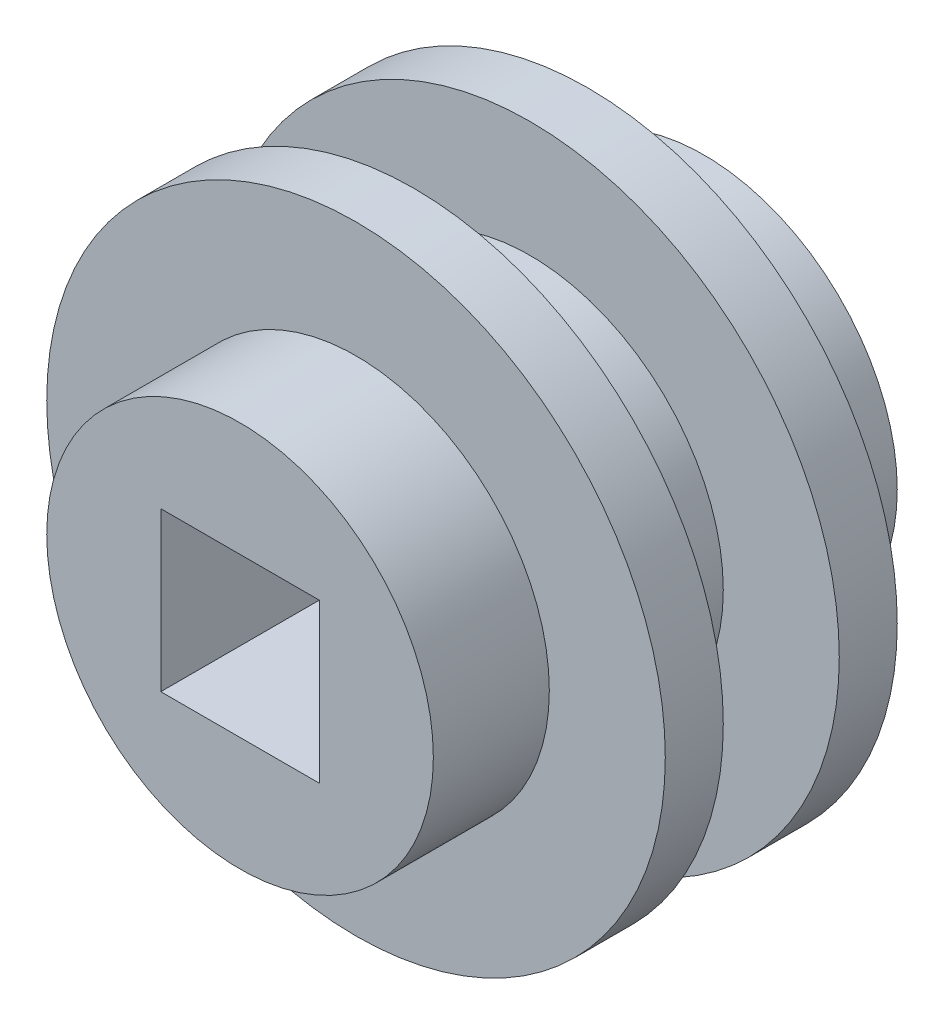
ISO-10303-21;
HEADER;
FILE_DESCRIPTION(('STEP AP214'),'2;1');
FILE_NAME('part.step','',(''),(''),'','','');
FILE_SCHEMA(('AUTOMOTIVE_DESIGN { 1 0 10303 214 1 1 1 1 }'));
ENDSEC;
DATA;
#1=APPLICATION_CONTEXT('core data for automotive mechanical design processes');
#2=APPLICATION_PROTOCOL_DEFINITION('international standard','automotive_design',2000,#1);
#3=PRODUCT_CONTEXT('',#1,'mechanical');
#4=PRODUCT('Part','Part','',(#3));
#5=PRODUCT_RELATED_PRODUCT_CATEGORY('part','',(#4));
#6=PRODUCT_DEFINITION_FORMATION('','',#4);
#7=PRODUCT_DEFINITION_CONTEXT('part definition',#1,'design');
#8=PRODUCT_DEFINITION('design','',#6,#7);
#9=PRODUCT_DEFINITION_SHAPE('','',#8);
#10=(LENGTH_UNIT() NAMED_UNIT(*) SI_UNIT(.MILLI.,.METRE.));
#11=(NAMED_UNIT(*) PLANE_ANGLE_UNIT() SI_UNIT($,.RADIAN.));
#12=(NAMED_UNIT(*) SI_UNIT($,.STERADIAN.) SOLID_ANGLE_UNIT());
#13=UNCERTAINTY_MEASURE_WITH_UNIT(LENGTH_MEASURE(1.E-05),#10,'distance_accuracy_value','');
#14=(GEOMETRIC_REPRESENTATION_CONTEXT(3) GLOBAL_UNCERTAINTY_ASSIGNED_CONTEXT((#13)) GLOBAL_UNIT_ASSIGNED_CONTEXT((#10,
#11,#12)) REPRESENTATION_CONTEXT('',''));
#15=CARTESIAN_POINT('',(0.,0.,0.));
#16=DIRECTION('',(0.,0.,1.));
#17=DIRECTION('',(1.,0.,0.));
#18=AXIS2_PLACEMENT_3D('',#15,#16,#17);
#19=CARTESIAN_POINT('',(0.,0.,3.));
#20=DIRECTION('',(0.,0.,-1.));
#21=DIRECTION('',(-1.,0.,0.));
#22=AXIS2_PLACEMENT_3D('',#19,#20,#21);
#23=CYLINDRICAL_SURFACE('',#22,8.);
#24=CARTESIAN_POINT('',(0.,0.,-3.));
#25=DIRECTION('',(0.,0.,1.));
#26=DIRECTION('',(1.,0.,0.));
#27=AXIS2_PLACEMENT_3D('',#24,#25,#26);
#28=CIRCLE('',#27,8.);
#29=CARTESIAN_POINT('',(8.,0.,-3.));
#30=VERTEX_POINT('',#29);
#31=EDGE_CURVE('E185',#30,#30,#28,.T.);
#32=ORIENTED_EDGE('',*,*,#31,.T.);
#33=EDGE_LOOP('',(#32));
#34=FACE_BOUND('',#33,.T.);
#35=CARTESIAN_POINT('',(0.,0.,-1.5));
#36=DIRECTION('',(0.,0.,1.));
#37=DIRECTION('',(1.,0.,0.));
#38=AXIS2_PLACEMENT_3D('',#35,#36,#37);
#39=CIRCLE('',#38,8.);
#40=CARTESIAN_POINT('',(8.,0.,-1.5));
#41=VERTEX_POINT('',#40);
#42=EDGE_CURVE('E189',#41,#41,#39,.T.);
#43=ORIENTED_EDGE('',*,*,#42,.F.);
#44=EDGE_LOOP('',(#43));
#45=FACE_BOUND('',#44,.T.);
#46=ADVANCED_FACE('F49',(#34,#45),#23,.T.);
#47=CARTESIAN_POINT('',(0.,0.,6.));
#48=DIRECTION('',(0.,0.,-1.));
#49=DIRECTION('',(-1.,0.,0.));
#50=AXIS2_PLACEMENT_3D('',#47,#48,#49);
#51=CYLINDRICAL_SURFACE('',#50,5.);
#52=CARTESIAN_POINT('',(0.,0.,-6.));
#53=DIRECTION('',(0.,0.,1.));
#54=DIRECTION('',(1.,0.,0.));
#55=AXIS2_PLACEMENT_3D('',#52,#53,#54);
#56=CIRCLE('',#55,5.);
#57=CARTESIAN_POINT('',(5.,0.,-6.));
#58=VERTEX_POINT('',#57);
#59=EDGE_CURVE('E113',#58,#58,#56,.T.);
#60=ORIENTED_EDGE('',*,*,#59,.T.);
#61=EDGE_LOOP('',(#60));
#62=FACE_BOUND('',#61,.T.);
#63=CARTESIAN_POINT('',(0.,0.,-3.));
#64=DIRECTION('',(0.,0.,1.));
#65=DIRECTION('',(1.,0.,0.));
#66=AXIS2_PLACEMENT_3D('',#63,#64,#65);
#67=CIRCLE('',#66,5.);
#68=CARTESIAN_POINT('',(5.,0.,-3.));
#69=VERTEX_POINT('',#68);
#70=EDGE_CURVE('E12',#69,#69,#67,.T.);
#71=ORIENTED_EDGE('',*,*,#70,.F.);
#72=EDGE_LOOP('',(#71));
#73=FACE_BOUND('',#72,.T.);
#74=ADVANCED_FACE('F148',(#62,#73),#51,.T.);
#75=CARTESIAN_POINT('',(2.05,0.,6.));
#76=DIRECTION('',(-1.,0.,0.));
#77=DIRECTION('',(0.,0.,1.));
#78=AXIS2_PLACEMENT_3D('',#75,#76,#77);
#79=PLANE('',#78);
#80=DIRECTION('',(0.,1.,0.));
#81=VECTOR('',#80,1.);
#82=CARTESIAN_POINT('',(2.05,0.,-6.));
#83=LINE('',#82,#81);
#84=CARTESIAN_POINT('',(2.05,-2.05,-6.));
#85=VERTEX_POINT('',#84);
#86=CARTESIAN_POINT('',(2.05,2.05,-6.));
#87=VERTEX_POINT('',#86);
#88=EDGE_CURVE('E121',#85,#87,#83,.T.);
#89=ORIENTED_EDGE('',*,*,#88,.F.);
#90=DIRECTION('',(0.,0.,-1.));
#91=VECTOR('',#90,1.);
#92=CARTESIAN_POINT('',(2.05,-2.05,6.));
#93=LINE('',#92,#91);
#94=CARTESIAN_POINT('',(2.05,-2.05,6.));
#95=VERTEX_POINT('',#94);
#96=EDGE_CURVE('E58',#95,#85,#93,.T.);
#97=ORIENTED_EDGE('',*,*,#96,.F.);
#98=DIRECTION('',(0.,1.,0.));
#99=VECTOR('',#98,1.);
#100=CARTESIAN_POINT('',(2.05,0.,6.));
#101=LINE('',#100,#99);
#102=CARTESIAN_POINT('',(2.05,2.05,6.));
#103=VERTEX_POINT('',#102);
#104=EDGE_CURVE('E111',#95,#103,#101,.T.);
#105=ORIENTED_EDGE('',*,*,#104,.T.);
#106=DIRECTION('',(0.,0.,-1.));
#107=VECTOR('',#106,1.);
#108=CARTESIAN_POINT('',(2.05,2.05,6.));
#109=LINE('',#108,#107);
#110=EDGE_CURVE('E89',#103,#87,#109,.T.);
#111=ORIENTED_EDGE('',*,*,#110,.T.);
#112=EDGE_LOOP('',(#89,#97,#105,#111));
#113=FACE_BOUND('',#112,.T.);
#114=ADVANCED_FACE('F51',(#113),#79,.T.);
#115=CARTESIAN_POINT('',(0.,-2.05,6.));
#116=DIRECTION('',(0.,1.,0.));
#117=DIRECTION('',(0.,0.,1.));
#118=AXIS2_PLACEMENT_3D('',#115,#116,#117);
#119=PLANE('',#118);
#120=DIRECTION('',(1.,0.,0.));
#121=VECTOR('',#120,1.);
#122=CARTESIAN_POINT('',(0.,-2.05,-6.));
#123=LINE('',#122,#121);
#124=CARTESIAN_POINT('',(-2.05,-2.05,-6.));
#125=VERTEX_POINT('',#124);
#126=EDGE_CURVE('E103',#125,#85,#123,.T.);
#127=ORIENTED_EDGE('',*,*,#126,.F.);
#128=DIRECTION('',(0.,0.,-1.));
#129=VECTOR('',#128,1.);
#130=CARTESIAN_POINT('',(-2.05,-2.05,6.));
#131=LINE('',#130,#129);
#132=CARTESIAN_POINT('',(-2.05,-2.05,6.));
#133=VERTEX_POINT('',#132);
#134=EDGE_CURVE('E97',#133,#125,#131,.T.);
#135=ORIENTED_EDGE('',*,*,#134,.F.);
#136=DIRECTION('',(1.,0.,0.));
#137=VECTOR('',#136,1.);
#138=CARTESIAN_POINT('',(0.,-2.05,6.));
#139=LINE('',#138,#137);
#140=EDGE_CURVE('E101',#133,#95,#139,.T.);
#141=ORIENTED_EDGE('',*,*,#140,.T.);
#142=ORIENTED_EDGE('',*,*,#96,.T.);
#143=EDGE_LOOP('',(#127,#135,#141,#142));
#144=FACE_BOUND('',#143,.T.);
#145=ADVANCED_FACE('F99',(#144),#119,.T.);
#146=CARTESIAN_POINT('',(-2.05,0.,6.));
#147=DIRECTION('',(-1.,0.,0.));
#148=DIRECTION('',(0.,0.,1.));
#149=AXIS2_PLACEMENT_3D('',#146,#147,#148);
#150=PLANE('',#149);
#151=DIRECTION('',(0.,1.,0.));
#152=VECTOR('',#151,1.);
#153=CARTESIAN_POINT('',(-2.05,0.,-6.));
#154=LINE('',#153,#152);
#155=CARTESIAN_POINT('',(-2.05,2.05,-6.));
#156=VERTEX_POINT('',#155);
#157=EDGE_CURVE('E82',#125,#156,#154,.T.);
#158=ORIENTED_EDGE('',*,*,#157,.T.);
#159=DIRECTION('',(0.,0.,-1.));
#160=VECTOR('',#159,1.);
#161=CARTESIAN_POINT('',(-2.05,2.05,6.));
#162=LINE('',#161,#160);
#163=CARTESIAN_POINT('',(-2.05,2.05,6.));
#164=VERTEX_POINT('',#163);
#165=EDGE_CURVE('E104',#164,#156,#162,.T.);
#166=ORIENTED_EDGE('',*,*,#165,.F.);
#167=DIRECTION('',(0.,1.,0.));
#168=VECTOR('',#167,1.);
#169=CARTESIAN_POINT('',(-2.05,0.,6.));
#170=LINE('',#169,#168);
#171=EDGE_CURVE('E106',#133,#164,#170,.T.);
#172=ORIENTED_EDGE('',*,*,#171,.F.);
#173=ORIENTED_EDGE('',*,*,#134,.T.);
#174=EDGE_LOOP('',(#158,#166,#172,#173));
#175=FACE_BOUND('',#174,.T.);
#176=ADVANCED_FACE('F107',(#175),#150,.F.);
#177=CARTESIAN_POINT('',(0.,2.05,6.));
#178=DIRECTION('',(0.,1.,0.));
#179=DIRECTION('',(0.,0.,1.));
#180=AXIS2_PLACEMENT_3D('',#177,#178,#179);
#181=PLANE('',#180);
#182=DIRECTION('',(1.,0.,0.));
#183=VECTOR('',#182,1.);
#184=CARTESIAN_POINT('',(0.,2.05,-6.));
#185=LINE('',#184,#183);
#186=EDGE_CURVE('E127',#156,#87,#185,.T.);
#187=ORIENTED_EDGE('',*,*,#186,.T.);
#188=ORIENTED_EDGE('',*,*,#110,.F.);
#189=DIRECTION('',(1.,0.,0.));
#190=VECTOR('',#189,1.);
#191=CARTESIAN_POINT('',(0.,2.05,6.));
#192=LINE('',#191,#190);
#193=EDGE_CURVE('E66',#164,#103,#192,.T.);
#194=ORIENTED_EDGE('',*,*,#193,.F.);
#195=ORIENTED_EDGE('',*,*,#165,.T.);
#196=EDGE_LOOP('',(#187,#188,#194,#195));
#197=FACE_BOUND('',#196,.T.);
#198=ADVANCED_FACE('F137',(#197),#181,.F.);
#199=CARTESIAN_POINT('',(0.,0.,3.));
#200=DIRECTION('',(0.,0.,1.));
#201=DIRECTION('',(1.,0.,0.));
#202=AXIS2_PLACEMENT_3D('',#199,#200,#201);
#203=CIRCLE('',#202,5.);
#204=CARTESIAN_POINT('',(5.,0.,3.));
#205=VERTEX_POINT('',#204);
#206=EDGE_CURVE('E182',#205,#205,#203,.T.);
#207=ORIENTED_EDGE('',*,*,#206,.T.);
#208=EDGE_LOOP('',(#207));
#209=FACE_BOUND('',#208,.T.);
#210=CARTESIAN_POINT('',(0.,0.,6.));
#211=DIRECTION('',(0.,0.,1.));
#212=DIRECTION('',(1.,0.,0.));
#213=AXIS2_PLACEMENT_3D('',#210,#211,#212);
#214=CIRCLE('',#213,5.);
#215=CARTESIAN_POINT('',(5.,0.,6.));
#216=VERTEX_POINT('',#215);
#217=EDGE_CURVE('E118',#216,#216,#214,.T.);
#218=ORIENTED_EDGE('',*,*,#217,.F.);
#219=EDGE_LOOP('',(#218));
#220=FACE_BOUND('',#219,.T.);
#221=ADVANCED_FACE('F139',(#209,#220),#51,.T.);
#222=CARTESIAN_POINT('',(0.,0.,6.));
#223=DIRECTION('',(0.,0.,1.));
#224=DIRECTION('',(1.,0.,0.));
#225=AXIS2_PLACEMENT_3D('',#222,#223,#224);
#226=PLANE('',#225);
#227=ORIENTED_EDGE('',*,*,#104,.F.);
#228=ORIENTED_EDGE('',*,*,#140,.F.);
#229=ORIENTED_EDGE('',*,*,#171,.T.);
#230=ORIENTED_EDGE('',*,*,#193,.T.);
#231=EDGE_LOOP('',(#227,#228,#229,#230));
#232=FACE_BOUND('',#231,.T.);
#233=ORIENTED_EDGE('',*,*,#217,.T.);
#234=EDGE_LOOP('',(#233));
#235=FACE_BOUND('',#234,.T.);
#236=ADVANCED_FACE('F109',(#232,#235),#226,.T.);
#237=CARTESIAN_POINT('',(0.,0.,-6.));
#238=DIRECTION('',(0.,0.,1.));
#239=DIRECTION('',(1.,0.,0.));
#240=AXIS2_PLACEMENT_3D('',#237,#238,#239);
#241=PLANE('',#240);
#242=ORIENTED_EDGE('',*,*,#88,.T.);
#243=ORIENTED_EDGE('',*,*,#186,.F.);
#244=ORIENTED_EDGE('',*,*,#157,.F.);
#245=ORIENTED_EDGE('',*,*,#126,.T.);
#246=EDGE_LOOP('',(#242,#243,#244,#245));
#247=FACE_BOUND('',#246,.T.);
#248=ORIENTED_EDGE('',*,*,#59,.F.);
#249=EDGE_LOOP('',(#248));
#250=FACE_BOUND('',#249,.T.);
#251=ADVANCED_FACE('F134',(#247,#250),#241,.F.);
#252=CARTESIAN_POINT('',(0.,0.,1.5));
#253=DIRECTION('',(0.,0.,1.));
#254=DIRECTION('',(1.,0.,0.));
#255=AXIS2_PLACEMENT_3D('',#252,#253,#254);
#256=CIRCLE('',#255,8.);
#257=CARTESIAN_POINT('',(8.,0.,1.5));
#258=VERTEX_POINT('',#257);
#259=EDGE_CURVE('E178',#258,#258,#256,.T.);
#260=ORIENTED_EDGE('',*,*,#259,.T.);
#261=EDGE_LOOP('',(#260));
#262=FACE_BOUND('',#261,.T.);
#263=CARTESIAN_POINT('',(0.,0.,3.));
#264=DIRECTION('',(0.,0.,1.));
#265=DIRECTION('',(1.,0.,0.));
#266=AXIS2_PLACEMENT_3D('',#263,#264,#265);
#267=CIRCLE('',#266,8.);
#268=CARTESIAN_POINT('',(8.,0.,3.));
#269=VERTEX_POINT('',#268);
#270=EDGE_CURVE('E124',#269,#269,#267,.T.);
#271=ORIENTED_EDGE('',*,*,#270,.F.);
#272=EDGE_LOOP('',(#271));
#273=FACE_BOUND('',#272,.T.);
#274=ADVANCED_FACE('F153',(#262,#273),#23,.T.);
#275=CARTESIAN_POINT('',(0.,0.,3.));
#276=DIRECTION('',(0.,0.,1.));
#277=DIRECTION('',(1.,0.,0.));
#278=AXIS2_PLACEMENT_3D('',#275,#276,#277);
#279=PLANE('',#278);
#280=ORIENTED_EDGE('',*,*,#206,.F.);
#281=EDGE_LOOP('',(#280));
#282=FACE_BOUND('',#281,.T.);
#283=ORIENTED_EDGE('',*,*,#270,.T.);
#284=EDGE_LOOP('',(#283));
#285=FACE_BOUND('',#284,.T.);
#286=ADVANCED_FACE('F164',(#282,#285),#279,.T.);
#287=CARTESIAN_POINT('',(0.,0.,-3.));
#288=DIRECTION('',(0.,0.,1.));
#289=DIRECTION('',(1.,0.,0.));
#290=AXIS2_PLACEMENT_3D('',#287,#288,#289);
#291=PLANE('',#290);
#292=ORIENTED_EDGE('',*,*,#70,.T.);
#293=EDGE_LOOP('',(#292));
#294=FACE_BOUND('',#293,.T.);
#295=ORIENTED_EDGE('',*,*,#31,.F.);
#296=EDGE_LOOP('',(#295));
#297=FACE_BOUND('',#296,.T.);
#298=ADVANCED_FACE('F170',(#294,#297),#291,.F.);
#299=CARTESIAN_POINT('',(0.,0.,1.5));
#300=DIRECTION('',(0.,0.,1.));
#301=DIRECTION('',(1.,0.,0.));
#302=AXIS2_PLACEMENT_3D('',#299,#300,#301);
#303=PLANE('',#302);
#304=ORIENTED_EDGE('',*,*,#259,.F.);
#305=EDGE_LOOP('',(#304));
#306=FACE_BOUND('',#305,.T.);
#307=CARTESIAN_POINT('',(0.,0.,1.5));
#308=DIRECTION('',(0.,0.,1.));
#309=DIRECTION('',(1.,0.,0.));
#310=AXIS2_PLACEMENT_3D('',#307,#308,#309);
#311=CIRCLE('',#310,5.);
#312=CARTESIAN_POINT('',(5.,0.,1.5));
#313=VERTEX_POINT('',#312);
#314=EDGE_CURVE('E192',#313,#313,#311,.T.);
#315=ORIENTED_EDGE('',*,*,#314,.T.);
#316=EDGE_LOOP('',(#315));
#317=FACE_BOUND('',#316,.T.);
#318=ADVANCED_FACE('F200',(#306,#317),#303,.F.);
#319=CARTESIAN_POINT('',(0.,0.,-1.5));
#320=DIRECTION('',(0.,0.,1.));
#321=DIRECTION('',(1.,0.,0.));
#322=AXIS2_PLACEMENT_3D('',#319,#320,#321);
#323=PLANE('',#322);
#324=ORIENTED_EDGE('',*,*,#42,.T.);
#325=EDGE_LOOP('',(#324));
#326=FACE_BOUND('',#325,.T.);
#327=CARTESIAN_POINT('',(0.,0.,-1.5));
#328=DIRECTION('',(0.,0.,1.));
#329=DIRECTION('',(1.,0.,0.));
#330=AXIS2_PLACEMENT_3D('',#327,#328,#329);
#331=CIRCLE('',#330,5.);
#332=CARTESIAN_POINT('',(5.,0.,-1.5));
#333=VERTEX_POINT('',#332);
#334=EDGE_CURVE('E194',#333,#333,#331,.T.);
#335=ORIENTED_EDGE('',*,*,#334,.F.);
#336=EDGE_LOOP('',(#335));
#337=FACE_BOUND('',#336,.T.);
#338=ADVANCED_FACE('F205',(#326,#337),#323,.T.);
#339=CARTESIAN_POINT('',(0.,0.,1.5));
#340=DIRECTION('',(0.,0.,-1.));
#341=DIRECTION('',(-1.,0.,0.));
#342=AXIS2_PLACEMENT_3D('',#339,#340,#341);
#343=CYLINDRICAL_SURFACE('',#342,5.);
#344=ORIENTED_EDGE('',*,*,#314,.F.);
#345=EDGE_LOOP('',(#344));
#346=FACE_BOUND('',#345,.T.);
#347=ORIENTED_EDGE('',*,*,#334,.T.);
#348=EDGE_LOOP('',(#347));
#349=FACE_BOUND('',#348,.T.);
#350=ADVANCED_FACE('F202',(#346,#349),#343,.T.);
#351=CLOSED_SHELL('',(#46,#74,#114,#145,#176,#198,#221,#236,#251,#274,#286,#298,#318,#338,#350));
#352=MANIFOLD_SOLID_BREP('B2',#351);
#353=ADVANCED_BREP_SHAPE_REPRESENTATION('',(#18,#352),#14);
#354=SHAPE_DEFINITION_REPRESENTATION(#9,#353);
ENDSEC;
END-ISO-10303-21;
